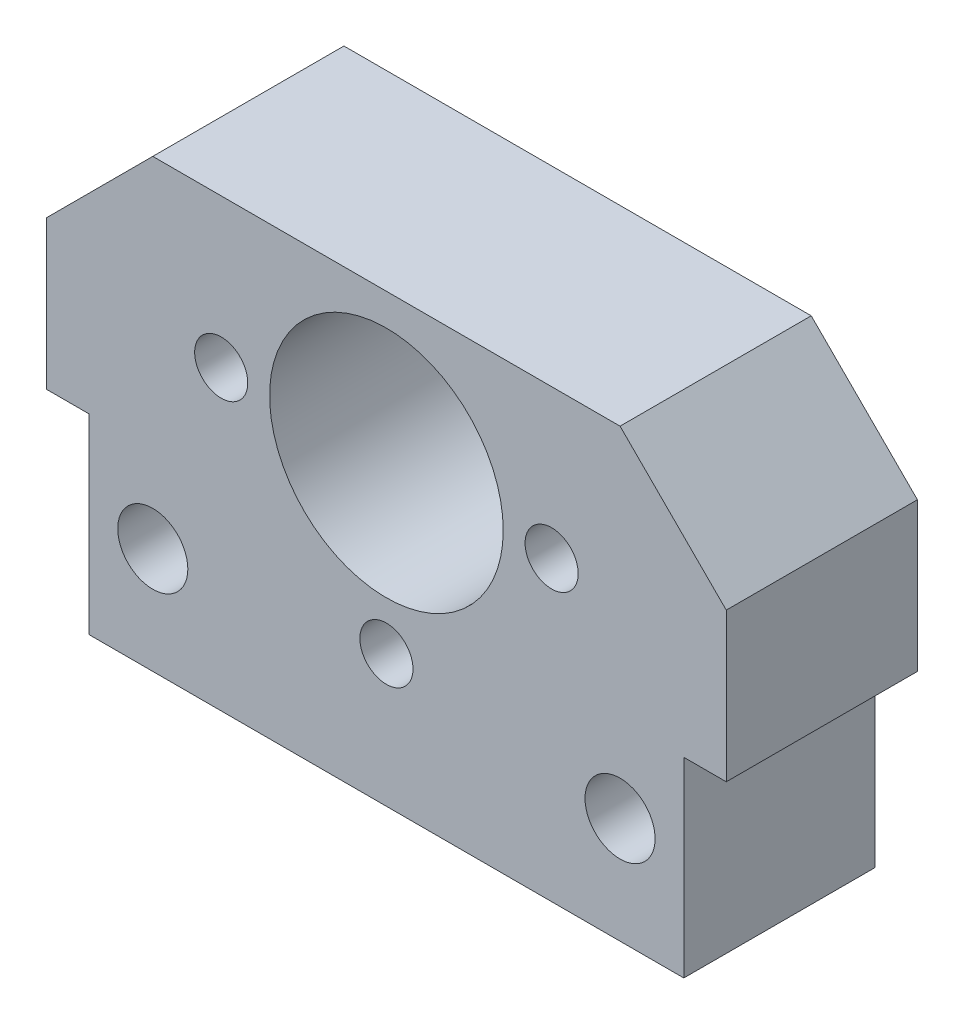
ISO-10303-21;
HEADER;
FILE_DESCRIPTION(('STEP AP214'),'2;1');
FILE_NAME('part.step','',(''),(''),'','','');
FILE_SCHEMA(('AUTOMOTIVE_DESIGN { 1 0 10303 214 1 1 1 1 }'));
ENDSEC;
DATA;
#1=APPLICATION_CONTEXT('core data for automotive mechanical design processes');
#2=APPLICATION_PROTOCOL_DEFINITION('international standard','automotive_design',2000,#1);
#3=PRODUCT_CONTEXT('',#1,'mechanical');
#4=PRODUCT('Part','Part','',(#3));
#5=PRODUCT_RELATED_PRODUCT_CATEGORY('part','',(#4));
#6=PRODUCT_DEFINITION_FORMATION('','',#4);
#7=PRODUCT_DEFINITION_CONTEXT('part definition',#1,'design');
#8=PRODUCT_DEFINITION('design','',#6,#7);
#9=PRODUCT_DEFINITION_SHAPE('','',#8);
#10=(LENGTH_UNIT() NAMED_UNIT(*) SI_UNIT(.MILLI.,.METRE.));
#11=(NAMED_UNIT(*) PLANE_ANGLE_UNIT() SI_UNIT($,.RADIAN.));
#12=(NAMED_UNIT(*) SI_UNIT($,.STERADIAN.) SOLID_ANGLE_UNIT());
#13=UNCERTAINTY_MEASURE_WITH_UNIT(LENGTH_MEASURE(1.E-05),#10,'distance_accuracy_value','');
#14=(GEOMETRIC_REPRESENTATION_CONTEXT(3) GLOBAL_UNCERTAINTY_ASSIGNED_CONTEXT((#13)) GLOBAL_UNIT_ASSIGNED_CONTEXT((#10,
#11,#12)) REPRESENTATION_CONTEXT('',''));
#15=CARTESIAN_POINT('',(0.,0.,0.));
#16=DIRECTION('',(0.,0.,1.));
#17=DIRECTION('',(1.,0.,0.));
#18=AXIS2_PLACEMENT_3D('',#15,#16,#17);
#19=CARTESIAN_POINT('',(0.,0.,9.));
#20=DIRECTION('',(1.,0.,0.));
#21=DIRECTION('',(0.,0.,-1.));
#22=AXIS2_PLACEMENT_3D('',#19,#20,#21);
#23=PLANE('',#22);
#24=DIRECTION('',(0.,-1.,0.));
#25=VECTOR('',#24,1.);
#26=CARTESIAN_POINT('',(0.,0.,9.));
#27=LINE('',#26,#25);
#28=CARTESIAN_POINT('',(0.,14.,9.));
#29=VERTEX_POINT('',#28);
#30=CARTESIAN_POINT('',(0.,7.,9.));
#31=VERTEX_POINT('',#30);
#32=EDGE_CURVE('E202',#29,#31,#27,.T.);
#33=ORIENTED_EDGE('',*,*,#32,.F.);
#34=DIRECTION('',(0.,0.,-1.));
#35=VECTOR('',#34,1.);
#36=CARTESIAN_POINT('',(0.,14.,9.));
#37=LINE('',#36,#35);
#38=CARTESIAN_POINT('',(0.,14.,0.));
#39=VERTEX_POINT('',#38);
#40=EDGE_CURVE('E209',#29,#39,#37,.T.);
#41=ORIENTED_EDGE('',*,*,#40,.T.);
#42=DIRECTION('',(0.,-1.,0.));
#43=VECTOR('',#42,1.);
#44=CARTESIAN_POINT('',(0.,0.,0.));
#45=LINE('',#44,#43);
#46=CARTESIAN_POINT('',(0.,7.,0.));
#47=VERTEX_POINT('',#46);
#48=EDGE_CURVE('E199',#39,#47,#45,.T.);
#49=ORIENTED_EDGE('',*,*,#48,.T.);
#50=DIRECTION('',(0.,0.,1.));
#51=VECTOR('',#50,1.);
#52=CARTESIAN_POINT('',(0.,7.,0.));
#53=LINE('',#52,#51);
#54=EDGE_CURVE('E161',#47,#31,#53,.T.);
#55=ORIENTED_EDGE('',*,*,#54,.T.);
#56=EDGE_LOOP('',(#33,#41,#49,#55));
#57=FACE_BOUND('',#56,.T.);
#58=ADVANCED_FACE('F32',(#57),#23,.F.);
#59=CARTESIAN_POINT('',(32.,0.,9.));
#60=DIRECTION('',(-1.,0.,0.));
#61=DIRECTION('',(0.,0.,1.));
#62=AXIS2_PLACEMENT_3D('',#59,#60,#61);
#63=PLANE('',#62);
#64=DIRECTION('',(0.,1.,0.));
#65=VECTOR('',#64,1.);
#66=CARTESIAN_POINT('',(32.,0.,0.));
#67=LINE('',#66,#65);
#68=CARTESIAN_POINT('',(32.,7.,0.));
#69=VERTEX_POINT('',#68);
#70=CARTESIAN_POINT('',(32.,14.,0.));
#71=VERTEX_POINT('',#70);
#72=EDGE_CURVE('E211',#69,#71,#67,.T.);
#73=ORIENTED_EDGE('',*,*,#72,.T.);
#74=DIRECTION('',(0.,0.,1.));
#75=VECTOR('',#74,1.);
#76=CARTESIAN_POINT('',(32.,14.,9.));
#77=LINE('',#76,#75);
#78=CARTESIAN_POINT('',(32.,14.,9.));
#79=VERTEX_POINT('',#78);
#80=EDGE_CURVE('E11',#71,#79,#77,.T.);
#81=ORIENTED_EDGE('',*,*,#80,.T.);
#82=DIRECTION('',(0.,1.,0.));
#83=VECTOR('',#82,1.);
#84=CARTESIAN_POINT('',(32.,0.,9.));
#85=LINE('',#84,#83);
#86=CARTESIAN_POINT('',(32.,7.,9.));
#87=VERTEX_POINT('',#86);
#88=EDGE_CURVE('E204',#87,#79,#85,.T.);
#89=ORIENTED_EDGE('',*,*,#88,.F.);
#90=DIRECTION('',(0.,0.,1.));
#91=VECTOR('',#90,1.);
#92=CARTESIAN_POINT('',(32.,7.,0.));
#93=LINE('',#92,#91);
#94=EDGE_CURVE('E149',#69,#87,#93,.T.);
#95=ORIENTED_EDGE('',*,*,#94,.F.);
#96=EDGE_LOOP('',(#73,#81,#89,#95));
#97=FACE_BOUND('',#96,.T.);
#98=ADVANCED_FACE('F242',(#97),#63,.F.);
#99=CARTESIAN_POINT('',(0.,19.,9.));
#100=DIRECTION('',(0.,-1.,0.));
#101=DIRECTION('',(0.,0.,-1.));
#102=AXIS2_PLACEMENT_3D('',#99,#100,#101);
#103=PLANE('',#102);
#104=DIRECTION('',(-1.,0.,0.));
#105=VECTOR('',#104,1.);
#106=CARTESIAN_POINT('',(0.,19.,0.));
#107=LINE('',#106,#105);
#108=CARTESIAN_POINT('',(27.,19.,0.));
#109=VERTEX_POINT('',#108);
#110=CARTESIAN_POINT('',(5.00000000000001,19.,0.));
#111=VERTEX_POINT('',#110);
#112=EDGE_CURVE('E205',#109,#111,#107,.T.);
#113=ORIENTED_EDGE('',*,*,#112,.T.);
#114=DIRECTION('',(0.,0.,1.));
#115=VECTOR('',#114,1.);
#116=CARTESIAN_POINT('',(5.00000000000001,19.,9.));
#117=LINE('',#116,#115);
#118=CARTESIAN_POINT('',(5.00000000000001,19.,9.));
#119=VERTEX_POINT('',#118);
#120=EDGE_CURVE('E53',#111,#119,#117,.T.);
#121=ORIENTED_EDGE('',*,*,#120,.T.);
#122=DIRECTION('',(-1.,0.,0.));
#123=VECTOR('',#122,1.);
#124=CARTESIAN_POINT('',(0.,19.,9.));
#125=LINE('',#124,#123);
#126=CARTESIAN_POINT('',(27.,19.,9.));
#127=VERTEX_POINT('',#126);
#128=EDGE_CURVE('E207',#127,#119,#125,.T.);
#129=ORIENTED_EDGE('',*,*,#128,.F.);
#130=DIRECTION('',(0.,0.,-1.));
#131=VECTOR('',#130,1.);
#132=CARTESIAN_POINT('',(27.,19.,9.));
#133=LINE('',#132,#131);
#134=EDGE_CURVE('E220',#127,#109,#133,.T.);
#135=ORIENTED_EDGE('',*,*,#134,.T.);
#136=EDGE_LOOP('',(#113,#121,#129,#135));
#137=FACE_BOUND('',#136,.T.);
#138=ADVANCED_FACE('F236',(#137),#103,.F.);
#139=CARTESIAN_POINT('',(0.,0.,9.));
#140=DIRECTION('',(0.,0.,-1.));
#141=DIRECTION('',(-1.,0.,0.));
#142=AXIS2_PLACEMENT_3D('',#139,#140,#141);
#143=PLANE('',#142);
#144=CARTESIAN_POINT('',(16.,12.,9.));
#145=DIRECTION('',(0.,0.,1.));
#146=DIRECTION('',(1.,0.,0.));
#147=AXIS2_PLACEMENT_3D('',#144,#145,#146);
#148=CIRCLE('',#147,5.5);
#149=CARTESIAN_POINT('',(21.5,12.,9.));
#150=VERTEX_POINT('',#149);
#151=EDGE_CURVE('E170',#150,#150,#148,.T.);
#152=ORIENTED_EDGE('',*,*,#151,.F.);
#153=EDGE_LOOP('',(#152));
#154=FACE_BOUND('',#153,.T.);
#155=CARTESIAN_POINT('',(8.22182540694798,12.,9.));
#156=DIRECTION('',(0.,0.,1.));
#157=DIRECTION('',(1.,0.,0.));
#158=AXIS2_PLACEMENT_3D('',#155,#156,#157);
#159=CIRCLE('',#158,1.25);
#160=CARTESIAN_POINT('',(9.47182540694798,12.,9.));
#161=VERTEX_POINT('',#160);
#162=EDGE_CURVE('E176',#161,#161,#159,.T.);
#163=ORIENTED_EDGE('',*,*,#162,.F.);
#164=EDGE_LOOP('',(#163));
#165=FACE_BOUND('',#164,.T.);
#166=CARTESIAN_POINT('',(27.,3.,9.));
#167=DIRECTION('',(0.,0.,1.));
#168=DIRECTION('',(-1.,0.,0.));
#169=AXIS2_PLACEMENT_3D('',#166,#167,#168);
#170=CIRCLE('',#169,1.65);
#171=CARTESIAN_POINT('',(25.35,3.,9.));
#172=VERTEX_POINT('',#171);
#173=EDGE_CURVE('E164',#172,#172,#170,.T.);
#174=ORIENTED_EDGE('',*,*,#173,.F.);
#175=EDGE_LOOP('',(#174));
#176=FACE_BOUND('',#175,.T.);
#177=CARTESIAN_POINT('',(5.,3.,9.));
#178=DIRECTION('',(0.,0.,1.));
#179=DIRECTION('',(1.,0.,0.));
#180=AXIS2_PLACEMENT_3D('',#177,#178,#179);
#181=CIRCLE('',#180,1.65);
#182=CARTESIAN_POINT('',(6.65,3.,9.));
#183=VERTEX_POINT('',#182);
#184=EDGE_CURVE('E184',#183,#183,#181,.T.);
#185=ORIENTED_EDGE('',*,*,#184,.F.);
#186=EDGE_LOOP('',(#185));
#187=FACE_BOUND('',#186,.T.);
#188=CARTESIAN_POINT('',(16.,4.22182540694798,9.));
#189=DIRECTION('',(0.,0.,1.));
#190=DIRECTION('',(1.,0.,0.));
#191=AXIS2_PLACEMENT_3D('',#188,#189,#190);
#192=CIRCLE('',#191,1.25);
#193=CARTESIAN_POINT('',(17.25,4.22182540694798,9.));
#194=VERTEX_POINT('',#193);
#195=EDGE_CURVE('E183',#194,#194,#192,.T.);
#196=ORIENTED_EDGE('',*,*,#195,.F.);
#197=EDGE_LOOP('',(#196));
#198=FACE_BOUND('',#197,.T.);
#199=CARTESIAN_POINT('',(23.778174593052,12.,9.));
#200=DIRECTION('',(0.,0.,1.));
#201=DIRECTION('',(-1.,0.,0.));
#202=AXIS2_PLACEMENT_3D('',#199,#200,#201);
#203=CIRCLE('',#202,1.25);
#204=CARTESIAN_POINT('',(22.528174593052,12.,9.));
#205=VERTEX_POINT('',#204);
#206=EDGE_CURVE('E169',#205,#205,#203,.T.);
#207=ORIENTED_EDGE('',*,*,#206,.F.);
#208=EDGE_LOOP('',(#207));
#209=FACE_BOUND('',#208,.T.);
#210=ORIENTED_EDGE('',*,*,#128,.T.);
#211=DIRECTION('',(0.707106781186548,0.707106781186547,0.));
#212=VECTOR('',#211,1.);
#213=CARTESIAN_POINT('',(0.,14.,9.));
#214=LINE('',#213,#212);
#215=EDGE_CURVE('E40',#119,#29,#214,.F.);
#216=ORIENTED_EDGE('',*,*,#215,.T.);
#217=ORIENTED_EDGE('',*,*,#32,.T.);
#218=DIRECTION('',(-1.,0.,0.));
#219=VECTOR('',#218,1.);
#220=CARTESIAN_POINT('',(0.,7.,9.));
#221=LINE('',#220,#219);
#222=CARTESIAN_POINT('',(2.,7.,9.));
#223=VERTEX_POINT('',#222);
#224=EDGE_CURVE('E123',#223,#31,#221,.T.);
#225=ORIENTED_EDGE('',*,*,#224,.F.);
#226=DIRECTION('',(0.,1.,0.));
#227=VECTOR('',#226,1.);
#228=CARTESIAN_POINT('',(2.,0.,9.));
#229=LINE('',#228,#227);
#230=CARTESIAN_POINT('',(2.,-2.,9.));
#231=VERTEX_POINT('',#230);
#232=EDGE_CURVE('E155',#231,#223,#229,.T.);
#233=ORIENTED_EDGE('',*,*,#232,.F.);
#234=DIRECTION('',(1.,0.,0.));
#235=VECTOR('',#234,1.);
#236=CARTESIAN_POINT('',(2.,-2.,9.));
#237=LINE('',#236,#235);
#238=CARTESIAN_POINT('',(30.,-2.,9.));
#239=VERTEX_POINT('',#238);
#240=EDGE_CURVE('E131',#231,#239,#237,.T.);
#241=ORIENTED_EDGE('',*,*,#240,.T.);
#242=DIRECTION('',(0.,-1.,0.));
#243=VECTOR('',#242,1.);
#244=CARTESIAN_POINT('',(30.,0.,9.));
#245=LINE('',#244,#243);
#246=CARTESIAN_POINT('',(30.,7.,9.));
#247=VERTEX_POINT('',#246);
#248=EDGE_CURVE('E147',#247,#239,#245,.T.);
#249=ORIENTED_EDGE('',*,*,#248,.F.);
#250=DIRECTION('',(-1.,0.,0.));
#251=VECTOR('',#250,1.);
#252=CARTESIAN_POINT('',(32.,7.,9.));
#253=LINE('',#252,#251);
#254=EDGE_CURVE('E143',#87,#247,#253,.T.);
#255=ORIENTED_EDGE('',*,*,#254,.F.);
#256=ORIENTED_EDGE('',*,*,#88,.T.);
#257=DIRECTION('',(0.707106781186546,-0.70710678118655,0.));
#258=VECTOR('',#257,1.);
#259=CARTESIAN_POINT('',(27.,19.,9.));
#260=LINE('',#259,#258);
#261=EDGE_CURVE('E224',#79,#127,#260,.F.);
#262=ORIENTED_EDGE('',*,*,#261,.T.);
#263=EDGE_LOOP('',(#210,#216,#217,#225,#233,#241,#249,#255,#256,#262));
#264=FACE_BOUND('',#263,.T.);
#265=ADVANCED_FACE('F228',(#154,#165,#176,#187,#198,#209,#264),#143,.F.);
#266=CARTESIAN_POINT('',(0.,0.,0.));
#267=DIRECTION('',(0.,0.,-1.));
#268=DIRECTION('',(-1.,0.,0.));
#269=AXIS2_PLACEMENT_3D('',#266,#267,#268);
#270=PLANE('',#269);
#271=ORIENTED_EDGE('',*,*,#48,.F.);
#272=DIRECTION('',(-0.707106781186548,-0.707106781186547,0.));
#273=VECTOR('',#272,1.);
#274=CARTESIAN_POINT('',(-7.,7.00000000000002,0.));
#275=LINE('',#274,#273);
#276=EDGE_CURVE('E218',#39,#111,#275,.F.);
#277=ORIENTED_EDGE('',*,*,#276,.T.);
#278=ORIENTED_EDGE('',*,*,#112,.F.);
#279=DIRECTION('',(-0.707106781186546,0.70710678118655,0.));
#280=VECTOR('',#279,1.);
#281=CARTESIAN_POINT('',(23.0000000000001,23.,0.));
#282=LINE('',#281,#280);
#283=EDGE_CURVE('E216',#109,#71,#282,.F.);
#284=ORIENTED_EDGE('',*,*,#283,.T.);
#285=ORIENTED_EDGE('',*,*,#72,.F.);
#286=DIRECTION('',(-1.,0.,0.));
#287=VECTOR('',#286,1.);
#288=CARTESIAN_POINT('',(32.,7.,0.));
#289=LINE('',#288,#287);
#290=CARTESIAN_POINT('',(30.,7.,0.));
#291=VERTEX_POINT('',#290);
#292=EDGE_CURVE('E145',#69,#291,#289,.T.);
#293=ORIENTED_EDGE('',*,*,#292,.T.);
#294=DIRECTION('',(0.,-1.,0.));
#295=VECTOR('',#294,1.);
#296=CARTESIAN_POINT('',(30.,0.,0.));
#297=LINE('',#296,#295);
#298=CARTESIAN_POINT('',(30.,-2.,0.));
#299=VERTEX_POINT('',#298);
#300=EDGE_CURVE('E138',#291,#299,#297,.T.);
#301=ORIENTED_EDGE('',*,*,#300,.T.);
#302=DIRECTION('',(1.,0.,0.));
#303=VECTOR('',#302,1.);
#304=CARTESIAN_POINT('',(2.,-2.,0.));
#305=LINE('',#304,#303);
#306=CARTESIAN_POINT('',(2.,-2.,0.));
#307=VERTEX_POINT('',#306);
#308=EDGE_CURVE('E129',#307,#299,#305,.T.);
#309=ORIENTED_EDGE('',*,*,#308,.F.);
#310=DIRECTION('',(0.,1.,0.));
#311=VECTOR('',#310,1.);
#312=CARTESIAN_POINT('',(2.,0.,0.));
#313=LINE('',#312,#311);
#314=CARTESIAN_POINT('',(2.,7.,0.));
#315=VERTEX_POINT('',#314);
#316=EDGE_CURVE('E112',#307,#315,#313,.T.);
#317=ORIENTED_EDGE('',*,*,#316,.T.);
#318=DIRECTION('',(-1.,0.,0.));
#319=VECTOR('',#318,1.);
#320=CARTESIAN_POINT('',(0.,7.,0.));
#321=LINE('',#320,#319);
#322=EDGE_CURVE('E122',#315,#47,#321,.T.);
#323=ORIENTED_EDGE('',*,*,#322,.T.);
#324=EDGE_LOOP('',(#271,#277,#278,#284,#285,#293,#301,#309,#317,#323));
#325=FACE_BOUND('',#324,.T.);
#326=CARTESIAN_POINT('',(16.,12.,0.));
#327=DIRECTION('',(0.,0.,1.));
#328=DIRECTION('',(1.,0.,0.));
#329=AXIS2_PLACEMENT_3D('',#326,#327,#328);
#330=CIRCLE('',#329,5.5);
#331=CARTESIAN_POINT('',(21.5,12.,0.));
#332=VERTEX_POINT('',#331);
#333=EDGE_CURVE('E166',#332,#332,#330,.T.);
#334=ORIENTED_EDGE('',*,*,#333,.T.);
#335=EDGE_LOOP('',(#334));
#336=FACE_BOUND('',#335,.T.);
#337=CARTESIAN_POINT('',(8.22182540694798,12.,0.));
#338=DIRECTION('',(0.,0.,1.));
#339=DIRECTION('',(1.,0.,0.));
#340=AXIS2_PLACEMENT_3D('',#337,#338,#339);
#341=CIRCLE('',#340,1.25);
#342=CARTESIAN_POINT('',(9.47182540694798,12.,0.));
#343=VERTEX_POINT('',#342);
#344=EDGE_CURVE('E173',#343,#343,#341,.T.);
#345=ORIENTED_EDGE('',*,*,#344,.T.);
#346=EDGE_LOOP('',(#345));
#347=FACE_BOUND('',#346,.T.);
#348=CARTESIAN_POINT('',(27.,3.,0.));
#349=DIRECTION('',(0.,0.,1.));
#350=DIRECTION('',(-1.,0.,0.));
#351=AXIS2_PLACEMENT_3D('',#348,#349,#350);
#352=CIRCLE('',#351,1.65);
#353=CARTESIAN_POINT('',(25.35,3.,0.));
#354=VERTEX_POINT('',#353);
#355=EDGE_CURVE('E187',#354,#354,#352,.T.);
#356=ORIENTED_EDGE('',*,*,#355,.T.);
#357=EDGE_LOOP('',(#356));
#358=FACE_BOUND('',#357,.T.);
#359=CARTESIAN_POINT('',(5.,3.,0.));
#360=DIRECTION('',(0.,0.,1.));
#361=DIRECTION('',(1.,0.,0.));
#362=AXIS2_PLACEMENT_3D('',#359,#360,#361);
#363=CIRCLE('',#362,1.65);
#364=CARTESIAN_POINT('',(6.65,3.,0.));
#365=VERTEX_POINT('',#364);
#366=EDGE_CURVE('E180',#365,#365,#363,.T.);
#367=ORIENTED_EDGE('',*,*,#366,.T.);
#368=EDGE_LOOP('',(#367));
#369=FACE_BOUND('',#368,.T.);
#370=CARTESIAN_POINT('',(16.,4.22182540694798,0.));
#371=DIRECTION('',(0.,0.,1.));
#372=DIRECTION('',(1.,0.,0.));
#373=AXIS2_PLACEMENT_3D('',#370,#371,#372);
#374=CIRCLE('',#373,1.25);
#375=CARTESIAN_POINT('',(17.25,4.22182540694798,0.));
#376=VERTEX_POINT('',#375);
#377=EDGE_CURVE('E179',#376,#376,#374,.T.);
#378=ORIENTED_EDGE('',*,*,#377,.T.);
#379=EDGE_LOOP('',(#378));
#380=FACE_BOUND('',#379,.T.);
#381=CARTESIAN_POINT('',(23.778174593052,12.,0.));
#382=DIRECTION('',(0.,0.,1.));
#383=DIRECTION('',(-1.,0.,0.));
#384=AXIS2_PLACEMENT_3D('',#381,#382,#383);
#385=CIRCLE('',#384,1.25);
#386=CARTESIAN_POINT('',(22.528174593052,12.,0.));
#387=VERTEX_POINT('',#386);
#388=EDGE_CURVE('E196',#387,#387,#385,.T.);
#389=ORIENTED_EDGE('',*,*,#388,.T.);
#390=EDGE_LOOP('',(#389));
#391=FACE_BOUND('',#390,.T.);
#392=ADVANCED_FACE('F135',(#325,#336,#347,#358,#369,#380,#391),#270,.T.);
#393=CARTESIAN_POINT('',(23.778174593052,12.,0.));
#394=DIRECTION('',(0.,0.,1.));
#395=DIRECTION('',(1.,0.,0.));
#396=AXIS2_PLACEMENT_3D('',#393,#394,#395);
#397=CYLINDRICAL_SURFACE('',#396,1.25);
#398=ORIENTED_EDGE('',*,*,#388,.F.);
#399=EDGE_LOOP('',(#398));
#400=FACE_BOUND('',#399,.T.);
#401=ORIENTED_EDGE('',*,*,#206,.T.);
#402=EDGE_LOOP('',(#401));
#403=FACE_BOUND('',#402,.T.);
#404=ADVANCED_FACE('F356',(#400,#403),#397,.F.);
#405=CARTESIAN_POINT('',(16.,4.22182540694798,0.));
#406=DIRECTION('',(0.,0.,1.));
#407=DIRECTION('',(1.,0.,0.));
#408=AXIS2_PLACEMENT_3D('',#405,#406,#407);
#409=CYLINDRICAL_SURFACE('',#408,1.25);
#410=ORIENTED_EDGE('',*,*,#377,.F.);
#411=EDGE_LOOP('',(#410));
#412=FACE_BOUND('',#411,.T.);
#413=ORIENTED_EDGE('',*,*,#195,.T.);
#414=EDGE_LOOP('',(#413));
#415=FACE_BOUND('',#414,.T.);
#416=ADVANCED_FACE('F346',(#412,#415),#409,.F.);
#417=CARTESIAN_POINT('',(5.,3.,0.));
#418=DIRECTION('',(0.,0.,1.));
#419=DIRECTION('',(1.,0.,0.));
#420=AXIS2_PLACEMENT_3D('',#417,#418,#419);
#421=CYLINDRICAL_SURFACE('',#420,1.65);
#422=ORIENTED_EDGE('',*,*,#366,.F.);
#423=EDGE_LOOP('',(#422));
#424=FACE_BOUND('',#423,.T.);
#425=ORIENTED_EDGE('',*,*,#184,.T.);
#426=EDGE_LOOP('',(#425));
#427=FACE_BOUND('',#426,.T.);
#428=ADVANCED_FACE('F336',(#424,#427),#421,.F.);
#429=CARTESIAN_POINT('',(27.,3.,0.));
#430=DIRECTION('',(0.,0.,1.));
#431=DIRECTION('',(1.,0.,0.));
#432=AXIS2_PLACEMENT_3D('',#429,#430,#431);
#433=CYLINDRICAL_SURFACE('',#432,1.65);
#434=ORIENTED_EDGE('',*,*,#355,.F.);
#435=EDGE_LOOP('',(#434));
#436=FACE_BOUND('',#435,.T.);
#437=ORIENTED_EDGE('',*,*,#173,.T.);
#438=EDGE_LOOP('',(#437));
#439=FACE_BOUND('',#438,.T.);
#440=ADVANCED_FACE('F326',(#436,#439),#433,.F.);
#441=CARTESIAN_POINT('',(8.22182540694798,12.,0.));
#442=DIRECTION('',(0.,0.,1.));
#443=DIRECTION('',(1.,0.,0.));
#444=AXIS2_PLACEMENT_3D('',#441,#442,#443);
#445=CYLINDRICAL_SURFACE('',#444,1.25);
#446=ORIENTED_EDGE('',*,*,#344,.F.);
#447=EDGE_LOOP('',(#446));
#448=FACE_BOUND('',#447,.T.);
#449=ORIENTED_EDGE('',*,*,#162,.T.);
#450=EDGE_LOOP('',(#449));
#451=FACE_BOUND('',#450,.T.);
#452=ADVANCED_FACE('F316',(#448,#451),#445,.F.);
#453=CARTESIAN_POINT('',(16.,12.,0.));
#454=DIRECTION('',(0.,0.,1.));
#455=DIRECTION('',(1.,0.,0.));
#456=AXIS2_PLACEMENT_3D('',#453,#454,#455);
#457=CYLINDRICAL_SURFACE('',#456,5.5);
#458=ORIENTED_EDGE('',*,*,#333,.F.);
#459=EDGE_LOOP('',(#458));
#460=FACE_BOUND('',#459,.T.);
#461=ORIENTED_EDGE('',*,*,#151,.T.);
#462=EDGE_LOOP('',(#461));
#463=FACE_BOUND('',#462,.T.);
#464=ADVANCED_FACE('F306',(#460,#463),#457,.F.);
#465=CARTESIAN_POINT('',(0.,7.,0.));
#466=DIRECTION('',(0.,1.,0.));
#467=DIRECTION('',(0.,0.,1.));
#468=AXIS2_PLACEMENT_3D('',#465,#466,#467);
#469=PLANE('',#468);
#470=ORIENTED_EDGE('',*,*,#224,.T.);
#471=ORIENTED_EDGE('',*,*,#54,.F.);
#472=ORIENTED_EDGE('',*,*,#322,.F.);
#473=DIRECTION('',(0.,0.,1.));
#474=VECTOR('',#473,1.);
#475=CARTESIAN_POINT('',(2.,7.,0.));
#476=LINE('',#475,#474);
#477=EDGE_CURVE('E118',#315,#223,#476,.T.);
#478=ORIENTED_EDGE('',*,*,#477,.T.);
#479=EDGE_LOOP('',(#470,#471,#472,#478));
#480=FACE_BOUND('',#479,.T.);
#481=ADVANCED_FACE('F258',(#480),#469,.F.);
#482=CARTESIAN_POINT('',(2.,0.,0.));
#483=DIRECTION('',(1.,0.,0.));
#484=DIRECTION('',(0.,0.,-1.));
#485=AXIS2_PLACEMENT_3D('',#482,#483,#484);
#486=PLANE('',#485);
#487=ORIENTED_EDGE('',*,*,#232,.T.);
#488=ORIENTED_EDGE('',*,*,#477,.F.);
#489=ORIENTED_EDGE('',*,*,#316,.F.);
#490=DIRECTION('',(0.,0.,1.));
#491=VECTOR('',#490,1.);
#492=CARTESIAN_POINT('',(2.,-2.,0.));
#493=LINE('',#492,#491);
#494=EDGE_CURVE('E116',#307,#231,#493,.T.);
#495=ORIENTED_EDGE('',*,*,#494,.T.);
#496=EDGE_LOOP('',(#487,#488,#489,#495));
#497=FACE_BOUND('',#496,.T.);
#498=ADVANCED_FACE('F115',(#497),#486,.F.);
#499=CARTESIAN_POINT('',(30.,0.,0.));
#500=DIRECTION('',(-1.,0.,0.));
#501=DIRECTION('',(0.,0.,1.));
#502=AXIS2_PLACEMENT_3D('',#499,#500,#501);
#503=PLANE('',#502);
#504=ORIENTED_EDGE('',*,*,#248,.T.);
#505=DIRECTION('',(0.,0.,1.));
#506=VECTOR('',#505,1.);
#507=CARTESIAN_POINT('',(30.,-2.,0.));
#508=LINE('',#507,#506);
#509=EDGE_CURVE('E132',#299,#239,#508,.T.);
#510=ORIENTED_EDGE('',*,*,#509,.F.);
#511=ORIENTED_EDGE('',*,*,#300,.F.);
#512=DIRECTION('',(0.,0.,1.));
#513=VECTOR('',#512,1.);
#514=CARTESIAN_POINT('',(30.,7.,0.));
#515=LINE('',#514,#513);
#516=EDGE_CURVE('E153',#291,#247,#515,.T.);
#517=ORIENTED_EDGE('',*,*,#516,.T.);
#518=EDGE_LOOP('',(#504,#510,#511,#517));
#519=FACE_BOUND('',#518,.T.);
#520=ADVANCED_FACE('F249',(#519),#503,.F.);
#521=CARTESIAN_POINT('',(32.,7.,0.));
#522=DIRECTION('',(0.,1.,0.));
#523=DIRECTION('',(0.,0.,1.));
#524=AXIS2_PLACEMENT_3D('',#521,#522,#523);
#525=PLANE('',#524);
#526=ORIENTED_EDGE('',*,*,#254,.T.);
#527=ORIENTED_EDGE('',*,*,#516,.F.);
#528=ORIENTED_EDGE('',*,*,#292,.F.);
#529=ORIENTED_EDGE('',*,*,#94,.T.);
#530=EDGE_LOOP('',(#526,#527,#528,#529));
#531=FACE_BOUND('',#530,.T.);
#532=ADVANCED_FACE('F245',(#531),#525,.F.);
#533=CARTESIAN_POINT('',(2.,-2.,0.));
#534=DIRECTION('',(0.,-1.,0.));
#535=DIRECTION('',(0.,0.,-1.));
#536=AXIS2_PLACEMENT_3D('',#533,#534,#535);
#537=PLANE('',#536);
#538=ORIENTED_EDGE('',*,*,#240,.F.);
#539=ORIENTED_EDGE('',*,*,#494,.F.);
#540=ORIENTED_EDGE('',*,*,#308,.T.);
#541=ORIENTED_EDGE('',*,*,#509,.T.);
#542=EDGE_LOOP('',(#538,#539,#540,#541));
#543=FACE_BOUND('',#542,.T.);
#544=ADVANCED_FACE('F127',(#543),#537,.T.);
#545=CARTESIAN_POINT('',(0.,14.,9.));
#546=DIRECTION('',(0.707106781186547,-0.707106781186548,0.));
#547=DIRECTION('',(0.,0.,-1.));
#548=AXIS2_PLACEMENT_3D('',#545,#546,#547);
#549=PLANE('',#548);
#550=ORIENTED_EDGE('',*,*,#215,.F.);
#551=ORIENTED_EDGE('',*,*,#120,.F.);
#552=ORIENTED_EDGE('',*,*,#276,.F.);
#553=ORIENTED_EDGE('',*,*,#40,.F.);
#554=EDGE_LOOP('',(#550,#551,#552,#553));
#555=FACE_BOUND('',#554,.T.);
#556=ADVANCED_FACE('F234',(#555),#549,.F.);
#557=CARTESIAN_POINT('',(27.,19.,9.));
#558=DIRECTION('',(-0.70710678118655,-0.707106781186546,0.));
#559=DIRECTION('',(0.,0.,-1.));
#560=AXIS2_PLACEMENT_3D('',#557,#558,#559);
#561=PLANE('',#560);
#562=ORIENTED_EDGE('',*,*,#261,.F.);
#563=ORIENTED_EDGE('',*,*,#80,.F.);
#564=ORIENTED_EDGE('',*,*,#283,.F.);
#565=ORIENTED_EDGE('',*,*,#134,.F.);
#566=EDGE_LOOP('',(#562,#563,#564,#565));
#567=FACE_BOUND('',#566,.T.);
#568=ADVANCED_FACE('F34',(#567),#561,.F.);
#569=CLOSED_SHELL('',(#58,#98,#138,#265,#392,#404,#416,#428,#440,#452,#464,#481,#498,#520,#532,
#544,#556,#568));
#570=MANIFOLD_SOLID_BREP('B2',#569);
#571=ADVANCED_BREP_SHAPE_REPRESENTATION('',(#18,#570),#14);
#572=SHAPE_DEFINITION_REPRESENTATION(#9,#571);
ENDSEC;
END-ISO-10303-21;
